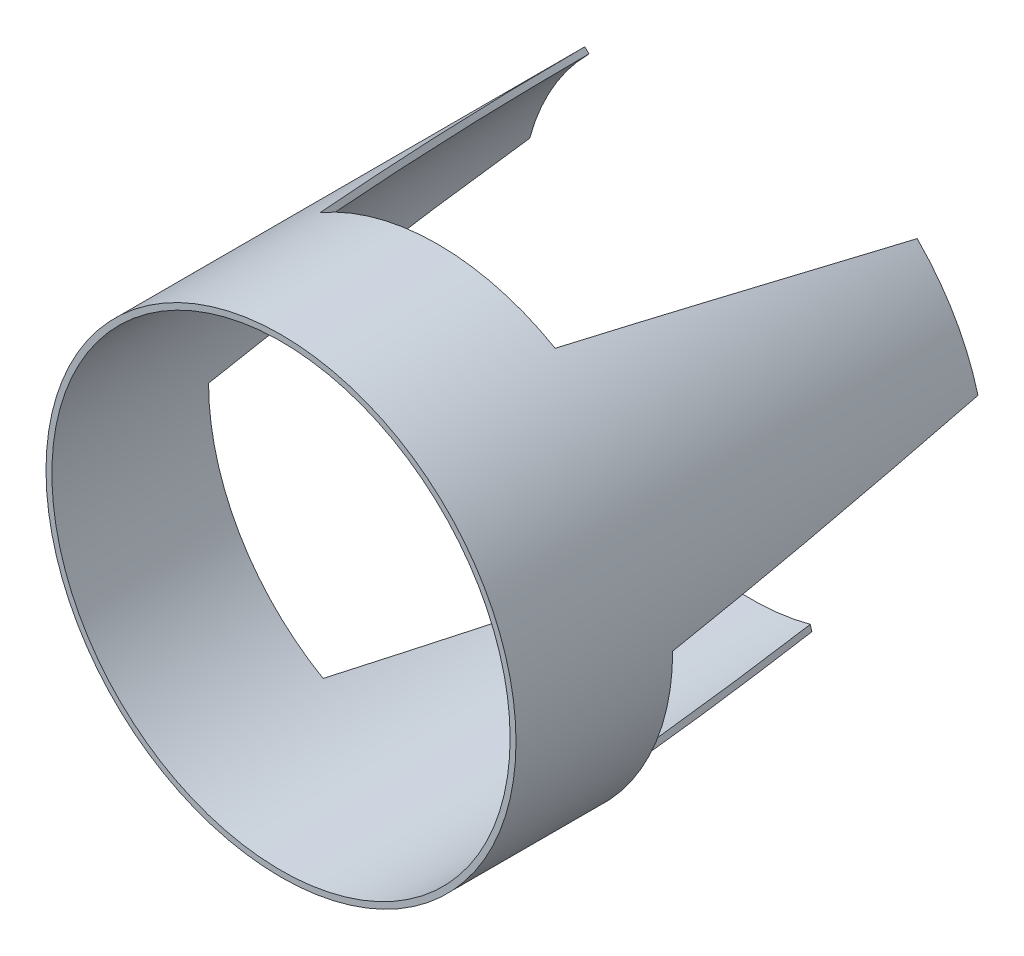
ISO-10303-21;
HEADER;
FILE_DESCRIPTION(('STEP AP214'),'2;1');
FILE_NAME('part.step','',(''),(''),'','','');
FILE_SCHEMA(('AUTOMOTIVE_DESIGN { 1 0 10303 214 1 1 1 1 }'));
ENDSEC;
DATA;
#1=APPLICATION_CONTEXT('core data for automotive mechanical design processes');
#2=APPLICATION_PROTOCOL_DEFINITION('international standard','automotive_design',2000,#1);
#3=PRODUCT_CONTEXT('',#1,'mechanical');
#4=PRODUCT('Part','Part','',(#3));
#5=PRODUCT_RELATED_PRODUCT_CATEGORY('part','',(#4));
#6=PRODUCT_DEFINITION_FORMATION('','',#4);
#7=PRODUCT_DEFINITION_CONTEXT('part definition',#1,'design');
#8=PRODUCT_DEFINITION('design','',#6,#7);
#9=PRODUCT_DEFINITION_SHAPE('','',#8);
#10=(LENGTH_UNIT() NAMED_UNIT(*) SI_UNIT(.MILLI.,.METRE.));
#11=(NAMED_UNIT(*) PLANE_ANGLE_UNIT() SI_UNIT($,.RADIAN.));
#12=(NAMED_UNIT(*) SI_UNIT($,.STERADIAN.) SOLID_ANGLE_UNIT());
#13=UNCERTAINTY_MEASURE_WITH_UNIT(LENGTH_MEASURE(1.E-05),#10,'distance_accuracy_value','');
#14=(GEOMETRIC_REPRESENTATION_CONTEXT(3) GLOBAL_UNCERTAINTY_ASSIGNED_CONTEXT((#13)) GLOBAL_UNIT_ASSIGNED_CONTEXT((#10,
#11,#12)) REPRESENTATION_CONTEXT('',''));
#15=CARTESIAN_POINT('',(0.,0.,0.));
#16=DIRECTION('',(0.,0.,1.));
#17=DIRECTION('',(1.,0.,0.));
#18=AXIS2_PLACEMENT_3D('',#15,#16,#17);
#19=CARTESIAN_POINT('',(0.,0.,0.));
#20=DIRECTION('',(0.,0.,-1.));
#21=DIRECTION('',(-1.,0.,0.));
#22=AXIS2_PLACEMENT_3D('',#19,#20,#21);
#23=PLANE('',#22);
#24=DIRECTION('',(-0.258819045102517,-0.965925826289069,0.));
#25=VECTOR('',#24,1.);
#26=CARTESIAN_POINT('',(-15.1409141384972,-56.5066608379106,0.));
#27=LINE('',#26,#25);
#28=CARTESIAN_POINT('',(-15.1409141384972,-56.5066608379106,0.));
#29=VERTEX_POINT('',#28);
#30=CARTESIAN_POINT('',(-15.5291427060463,-57.9555495773722,0.));
#31=VERTEX_POINT('',#30);
#32=EDGE_CURVE('E115',#29,#31,#27,.T.);
#33=ORIENTED_EDGE('',*,*,#32,.F.);
#34=CARTESIAN_POINT('',(0.,0.,0.));
#35=DIRECTION('',(0.,0.,1.));
#36=DIRECTION('',(1.,0.,0.));
#37=AXIS2_PLACEMENT_3D('',#34,#35,#36);
#38=CIRCLE('',#37,58.5);
#39=CARTESIAN_POINT('',(15.1409141384977,-56.5066608379105,0.));
#40=VERTEX_POINT('',#39);
#41=EDGE_CURVE('E45',#29,#40,#38,.T.);
#42=ORIENTED_EDGE('',*,*,#41,.T.);
#43=DIRECTION('',(-0.258819045102526,0.965925826289067,0.));
#44=VECTOR('',#43,1.);
#45=CARTESIAN_POINT('',(15.5291427061514,-57.955549577344,0.));
#46=LINE('',#45,#44);
#47=CARTESIAN_POINT('',(15.5291427061514,-57.9555495773441,0.));
#48=VERTEX_POINT('',#47);
#49=EDGE_CURVE('E163',#48,#40,#46,.T.);
#50=ORIENTED_EDGE('',*,*,#49,.F.);
#51=CARTESIAN_POINT('',(0.,0.,0.));
#52=DIRECTION('',(0.,0.,-1.));
#53=DIRECTION('',(1.,0.,0.));
#54=AXIS2_PLACEMENT_3D('',#51,#52,#53);
#55=CIRCLE('',#54,60.);
#56=EDGE_CURVE('E124',#48,#31,#55,.T.);
#57=ORIENTED_EDGE('',*,*,#56,.T.);
#58=EDGE_LOOP('',(#33,#42,#50,#57));
#59=FACE_BOUND('',#58,.T.);
#60=ADVANCED_FACE('F15',(#59),#23,.T.);
#61=CARTESIAN_POINT('',(42.4264068711928,42.4264068711929,0.));
#62=VERTEX_POINT('',#61);
#63=CARTESIAN_POINT('',(57.9555495773161,15.5291427062558,0.));
#64=VERTEX_POINT('',#63);
#65=EDGE_CURVE('E140',#62,#64,#55,.T.);
#66=ORIENTED_EDGE('',*,*,#65,.T.);
#67=DIRECTION('',(-0.965925826289069,-0.25881904510252,0.));
#68=VECTOR('',#67,1.);
#69=CARTESIAN_POINT('',(57.9555495773441,15.5291427061512,0.));
#70=LINE('',#69,#68);
#71=CARTESIAN_POINT('',(56.5066608379105,15.1409141384975,0.));
#72=VERTEX_POINT('',#71);
#73=EDGE_CURVE('E254',#64,#72,#70,.T.);
#74=ORIENTED_EDGE('',*,*,#73,.T.);
#75=CARTESIAN_POINT('',(41.365746699413,41.3657466994131,0.));
#76=VERTEX_POINT('',#75);
#77=EDGE_CURVE('E136',#72,#76,#38,.T.);
#78=ORIENTED_EDGE('',*,*,#77,.T.);
#79=DIRECTION('',(0.70710678118655,0.707106781186545,0.));
#80=VECTOR('',#79,1.);
#81=CARTESIAN_POINT('',(41.365746699413,41.3657466994131,0.));
#82=LINE('',#81,#80);
#83=EDGE_CURVE('E187',#76,#62,#82,.T.);
#84=ORIENTED_EDGE('',*,*,#83,.T.);
#85=EDGE_LOOP('',(#66,#74,#78,#84));
#86=FACE_BOUND('',#85,.T.);
#87=ADVANCED_FACE('F236',(#86),#23,.T.);
#88=CARTESIAN_POINT('',(0.,0.,120.));
#89=DIRECTION('',(0.,0.,-1.));
#90=DIRECTION('',(-1.,0.,0.));
#91=AXIS2_PLACEMENT_3D('',#88,#89,#90);
#92=CYLINDRICAL_SURFACE('',#91,60.);
#93=CARTESIAN_POINT('',(-60.,0.,80.));
#94=CARTESIAN_POINT('',(-60.0000297278605,0.642846188178234,76.729155216476));
#95=CARTESIAN_POINT('',(-59.9896682161173,1.28735699019478,73.4586421596736));
#96=CARTESIAN_POINT('',(-59.9480690658316,2.57776599537224,66.918011010002));
#97=CARTESIAN_POINT('',(-59.9168313566957,3.22366420321734,63.6478929185058));
#98=CARTESIAN_POINT('',(-59.810945745323,4.86214663308085,55.3490186665964));
#99=CARTESIAN_POINT('',(-59.7219862163258,5.85434948110681,50.3203639184538));
#100=CARTESIAN_POINT('',(-59.4951734283905,7.8302713126087,40.2624703606781));
#101=CARTESIAN_POINT('',(-59.3573200116705,8.81399026869637,35.2332315492124));
#102=CARTESIAN_POINT('',(-59.1151828549255,10.2781494088528,27.6873579864123));
#103=CARTESIAN_POINT('',(-59.0285584961352,10.7643873821746,25.1712691981862));
#104=CARTESIAN_POINT('',(-58.8438519566513,11.7321646658726,20.1386061251849));
#105=CARTESIAN_POINT('',(-58.7457697747269,12.213703975744,17.6220318403577));
#106=CARTESIAN_POINT('',(-58.5385122695138,13.1712755484237,12.5882931329614));
#107=CARTESIAN_POINT('',(-58.4293369469356,13.6473078115847,10.0711287104301));
#108=CARTESIAN_POINT('',(-58.2003281380882,14.5931104246774,5.036108306337));
#109=CARTESIAN_POINT('',(-58.0804946515377,15.0628807744438,2.51825232475699));
#110=CARTESIAN_POINT('',(-57.9555495773441,15.5291427061512,0.));
#111=B_SPLINE_CURVE_WITH_KNOTS('',3,(#93,#94,#95,#96,#97,#98,#99,#100,#101,#102,#103,#104,#105,
#106,#107,#108,#109,#110),.UNSPECIFIED.,.F.,.F.,(4,2,2,2,2,2,2,2,4),(0.,10.0002292757606,
20.0004923677393,35.379377408289,50.7583120774031,58.4506019146751,66.1428925782588,
73.8351827490979,81.5274731229181),.UNSPECIFIED.);
#112=CARTESIAN_POINT('',(-60.,0.,80.));
#113=VERTEX_POINT('',#112);
#114=CARTESIAN_POINT('',(-57.9555495773441,15.5291427061512,0.));
#115=VERTEX_POINT('',#114);
#116=EDGE_CURVE('E373',#113,#115,#111,.T.);
#117=ORIENTED_EDGE('',*,*,#116,.F.);
#118=CARTESIAN_POINT('',(0.,0.,80.));
#119=DIRECTION('',(0.,0.,-1.));
#120=DIRECTION('',(1.,0.,0.));
#121=AXIS2_PLACEMENT_3D('',#118,#119,#120);
#122=CIRCLE('',#121,60.);
#123=CARTESIAN_POINT('',(-30.,-51.9615242270664,80.));
#124=VERTEX_POINT('',#123);
#125=EDGE_CURVE('E318',#124,#113,#122,.T.);
#126=ORIENTED_EDGE('',*,*,#125,.F.);
#127=CARTESIAN_POINT('',(-30.,-51.9615242270664,80.));
#128=CARTESIAN_POINT('',(-29.449918177119,-52.2791469795733,76.7276617860774));
#129=CARTESIAN_POINT('',(-28.892528796003,-52.5892751058101,73.4558291201873));
#130=CARTESIAN_POINT('',(-27.7646466865433,-53.1933532711415,66.9129174843199));
#131=CARTESIAN_POINT('',(-27.1941539142323,-53.4873032559404,63.6418385169086));
#132=CARTESIAN_POINT('',(-25.7316251948103,-54.2112639331826,55.3409911975984));
#133=CARTESIAN_POINT('',(-24.8316806454118,-54.6294204095292,50.3115765500915));
#134=CARTESIAN_POINT('',(-23.0105820483431,-55.4211038979189,40.2530547764168));
#135=CARTESIAN_POINT('',(-22.0894279328347,-55.7946307671919,35.2239476512841));
#136=CARTESIAN_POINT('',(-20.6966454038644,-56.3195837849319,27.6789421458789));
#137=CARTESIAN_POINT('',(-20.2304568865246,-56.4887061159248,25.1632585762426));
#138=CARTESIAN_POINT('',(-19.2953139352809,-56.814927722282,20.1316235411478));
#139=CARTESIAN_POINT('',(-18.8263595010845,-56.972026996375,17.6156720756611));
#140=CARTESIAN_POINT('',(-17.8865546709448,-57.2740317234357,12.5833921683718));
#141=CARTESIAN_POINT('',(-17.4157042751353,-57.4189371772633,10.0670637265958));
#142=CARTESIAN_POINT('',(-16.4729764842333,-57.6964715063335,5.03392219010989));
#143=CARTESIAN_POINT('',(-16.00109908911,-57.8291003812081,2.5171090953855));
#144=CARTESIAN_POINT('',(-15.5291427061511,-57.9555495773441,0.));
#145=B_SPLINE_CURVE_WITH_KNOTS('',3,(#127,#128,#129,#130,#131,#132,#133,#134,#135,#136,#137,
#138,#139,#140,#141,#142,#143,#144),.UNSPECIFIED.,.F.,.F.,(4,2,2,2,2,2,2,2,4),(0.,
10.0002271930249,20.0004879459086,35.3793803521653,50.7583219541819,58.4505909352589,
66.1428607296868,73.8351299816371,81.5273994641764),.UNSPECIFIED.);
#146=EDGE_CURVE('E120',#124,#31,#145,.T.);
#147=ORIENTED_EDGE('',*,*,#146,.T.);
#148=ORIENTED_EDGE('',*,*,#56,.F.);
#149=CARTESIAN_POINT('',(29.9999999996795,-51.9615242272514,80.));
#150=CARTESIAN_POINT('',(29.4499181767901,-52.2791469797586,76.7276617860788));
#151=CARTESIAN_POINT('',(28.8925287956703,-52.5892751059928,73.4558291201892));
#152=CARTESIAN_POINT('',(27.7646466862109,-53.193353271315,66.9129174843209));
#153=CARTESIAN_POINT('',(27.194153913904,-53.4873032561072,63.6418385169083));
#154=CARTESIAN_POINT('',(25.7316251945021,-54.2112639333286,55.3409911975987));
#155=CARTESIAN_POINT('',(24.8316806451241,-54.6294204096595,50.3115765500929));
#156=CARTESIAN_POINT('',(23.0105820481061,-55.4211038980168,40.2530547764184));
#157=CARTESIAN_POINT('',(22.0894279326279,-55.7946307672732,35.2239476512849));
#158=CARTESIAN_POINT('',(20.696645403705,-56.3195837849903,27.6789421458785));
#159=CARTESIAN_POINT('',(20.2304568863813,-56.488706115976,25.1632585762417));
#160=CARTESIAN_POINT('',(19.2953139351695,-56.8149277223197,20.1316235411462));
#161=CARTESIAN_POINT('',(18.826359500989,-56.9720269964064,17.6156720756592));
#162=CARTESIAN_POINT('',(17.8865546708798,-57.2740317234558,12.5833921683697));
#163=CARTESIAN_POINT('',(17.415704275085,-57.4189371772785,10.0670637265938));
#164=CARTESIAN_POINT('',(16.4729764842101,-57.69647150634,5.03392219010848));
#165=CARTESIAN_POINT('',(16.0010990890994,-57.8291003812109,2.51710909538463));
#166=CARTESIAN_POINT('',(15.5291427061514,-57.9555495773441,0.));
#167=B_SPLINE_CURVE_WITH_KNOTS('',3,(#149,#150,#151,#152,#153,#154,#155,#156,#157,#158,#159,
#160,#161,#162,#163,#164,#165,#166),.UNSPECIFIED.,.F.,.F.,(4,2,2,2,2,2,2,2,4),(0.,
10.0002271930248,20.0004879459085,35.3793803521476,50.7583219541467,58.4505909352146,
66.1428607296335,73.8351299815747,81.5273994641049),.UNSPECIFIED.);
#168=CARTESIAN_POINT('',(29.9999999996795,-51.9615242272514,80.));
#169=VERTEX_POINT('',#168);
#170=EDGE_CURVE('E285',#169,#48,#167,.T.);
#171=ORIENTED_EDGE('',*,*,#170,.F.);
#172=CARTESIAN_POINT('',(0.,0.,80.));
#173=DIRECTION('',(0.,0.,-1.));
#174=DIRECTION('',(1.,0.,0.));
#175=AXIS2_PLACEMENT_3D('',#172,#173,#174);
#176=CIRCLE('',#175,60.);
#177=CARTESIAN_POINT('',(60.,0.,80.));
#178=VERTEX_POINT('',#177);
#179=EDGE_CURVE('E265',#178,#169,#176,.T.);
#180=ORIENTED_EDGE('',*,*,#179,.F.);
#181=CARTESIAN_POINT('',(57.9555495773232,15.5291427062017,0.));
#182=CARTESIAN_POINT('',(58.1199779448731,14.9155976493719,3.27233821391632));
#183=CARTESIAN_POINT('',(58.2752757240985,14.2969337853482,6.54417087980376));
#184=CARTESIAN_POINT('',(58.5668530545349,13.0511363928844,13.0870825156694));
#185=CARTESIAN_POINT('',(58.7031325419207,12.4240028360278,16.3581614830814));
#186=CARTESIAN_POINT('',(59.0238945706893,10.8239337630771,24.6590088023933));
#187=CARTESIAN_POINT('',(59.1948799217028,9.84642722067162,29.6884234499006));
#188=CARTESIAN_POINT('',(59.4882524494548,7.88247828905386,39.7469452235767));
#189=CARTESIAN_POINT('',(59.6106394707302,6.89603587126653,44.7760523487103));
#190=CARTESIAN_POINT('',(59.7572265039701,5.41484341735429,52.3210578541167));
#191=CARTESIAN_POINT('',(59.7999276643829,4.92076780832299,54.8367414237534));
#192=CARTESIAN_POINT('',(59.8730007333817,3.93305671579483,59.868376458849));
#193=CARTESIAN_POINT('',(59.903372640664,3.43942123234452,62.3843279243361));
#194=CARTESIAN_POINT('',(59.9518474174738,2.45347490016677,67.4166078316262));
#195=CARTESIAN_POINT('',(59.9699502878666,1.96116405134592,69.9329362734026));
#196=CARTESIAN_POINT('',(59.9940319573644,0.978727760919796,74.9660778098893));
#197=CARTESIAN_POINT('',(60.0000107561062,0.488602319380037,77.4828909046141));
#198=CARTESIAN_POINT('',(60.,0.,80.));
#199=B_SPLINE_CURVE_WITH_KNOTS('',3,(#181,#182,#183,#184,#185,#186,#187,#188,#189,#190,#191,
#192,#193,#194,#195,#196,#197,#198),.UNSPECIFIED.,.F.,.F.,(4,2,2,2,2,2,2,2,4),(0.,
10.0002271930249,20.0004879459086,35.3793803521678,50.7583219541871,58.4505909352654,
66.1428607296946,73.8351299816461,81.5273994641867),.UNSPECIFIED.);
#200=EDGE_CURVE('E262',#64,#178,#199,.T.);
#201=ORIENTED_EDGE('',*,*,#200,.F.);
#202=ORIENTED_EDGE('',*,*,#65,.F.);
#203=CARTESIAN_POINT('',(42.4264068711927,42.4264068711929,0.));
#204=CARTESIAN_POINT('',(41.9826909647803,42.8701610586443,3.27381653027227));
#205=CARTESIAN_POINT('',(41.5294993020639,43.309390646772,6.54695744763124));
#206=CARTESIAN_POINT('',(40.6051656345155,44.1771615529254,13.0921328694367));
#207=CARTESIAN_POINT('',(40.1340235689249,44.6057028347652,16.3641673701004));
#208=CARTESIAN_POINT('',(38.9168331980027,45.6776292055111,24.6669724341608));
#209=CARTESIAN_POINT('',(38.1592193397265,46.3125989616626,29.6971398407958));
#210=CARTESIAN_POINT('',(36.6084927538434,47.5478784948421,39.7562783736417));
#211=CARTESIAN_POINT('',(35.8153799116776,48.1481881600042,44.7852494959395));
#212=CARTESIAN_POINT('',(34.6029979690574,49.0191864175403,52.3293924812002));
#213=CARTESIAN_POINT('',(34.1950082882908,49.3046577881481,54.8446826228858));
#214=CARTESIAN_POINT('',(33.3722431509834,49.8652294404963,59.8753112172308));
#215=CARTESIAN_POINT('',(32.9574676937264,50.140329721142,62.3906496698954));
#216=CARTESIAN_POINT('',(32.1218938800863,50.6796915910874,67.4214875053711));
#217=CARTESIAN_POINT('',(31.701095524159,50.9439531812073,69.9369868881701));
#218=CARTESIAN_POINT('',(30.8542704173363,51.4612527017276,74.9682597112893));
#219=CARTESIAN_POINT('',(30.4282436662554,51.7142906317298,77.4840331516191));
#220=CARTESIAN_POINT('',(30.,51.9615242270664,80.));
#221=B_SPLINE_CURVE_WITH_KNOTS('',3,(#203,#204,#205,#206,#207,#208,#209,#210,#211,#212,#213,
#214,#215,#216,#217,#218,#219,#220),.UNSPECIFIED.,.F.,.F.,(4,2,2,2,2,2,2,2,4),(0.,
10.0002291012252,20.0004920542418,35.3793772810765,50.7583121406814,58.4506020023325,
66.142892675842,73.8351827671622,81.5274731313452),.UNSPECIFIED.);
#222=CARTESIAN_POINT('',(30.,51.9615242270664,80.));
#223=VERTEX_POINT('',#222);
#224=EDGE_CURVE('E225',#62,#223,#221,.T.);
#225=ORIENTED_EDGE('',*,*,#224,.T.);
#226=CARTESIAN_POINT('',(0.,0.,80.));
#227=DIRECTION('',(0.,0.,1.));
#228=DIRECTION('',(1.,0.,0.));
#229=AXIS2_PLACEMENT_3D('',#226,#227,#228);
#230=CIRCLE('',#229,60.);
#231=CARTESIAN_POINT('',(-30.,51.9615242270663,80.));
#232=VERTEX_POINT('',#231);
#233=EDGE_CURVE('E175',#223,#232,#230,.T.);
#234=ORIENTED_EDGE('',*,*,#233,.T.);
#235=CARTESIAN_POINT('',(-42.4264068712243,42.4264068711476,0.));
#236=CARTESIAN_POINT('',(-41.9826909647928,42.8701610586269,3.27381653026588));
#237=CARTESIAN_POINT('',(-41.5294993020684,43.3093906467663,6.54695744762219));
#238=CARTESIAN_POINT('',(-40.605165634514,44.1771615529284,13.0921328694257));
#239=CARTESIAN_POINT('',(-40.1340235689254,44.6057028347652,16.3641673700901));
#240=CARTESIAN_POINT('',(-38.9168331980056,45.6776292055077,24.6669724341522));
#241=CARTESIAN_POINT('',(-38.1592193397282,46.312598961661,29.6971398407876));
#242=CARTESIAN_POINT('',(-36.6084927538441,47.5478784948418,39.7562783736349));
#243=CARTESIAN_POINT('',(-35.8153799116787,48.1481881600034,44.7852494959337));
#244=CARTESIAN_POINT('',(-34.6029979690583,49.0191864175396,52.3293924811956));
#245=CARTESIAN_POINT('',(-34.1950082882915,49.3046577881476,54.8446826228816));
#246=CARTESIAN_POINT('',(-33.3722431509839,49.8652294404959,59.8753112172275));
#247=CARTESIAN_POINT('',(-32.9574676937269,50.1403297211417,62.3906496698924));
#248=CARTESIAN_POINT('',(-32.1218938800867,50.6796915910872,67.421487505369));
#249=CARTESIAN_POINT('',(-31.7010955241593,50.9439531812071,69.9369868881684));
#250=CARTESIAN_POINT('',(-30.8542704173365,51.4612527017274,74.9682597112884));
#251=CARTESIAN_POINT('',(-30.4282436662555,51.7142906317297,77.4840331516187));
#252=CARTESIAN_POINT('',(-30.,51.9615242270663,80.));
#253=B_SPLINE_CURVE_WITH_KNOTS('',3,(#235,#236,#237,#238,#239,#240,#241,#242,#243,#244,#245,
#246,#247,#248,#249,#250,#251,#252),.UNSPECIFIED.,.F.,.F.,(4,2,2,2,2,2,2,2,4),(0.,
10.0002291012252,20.0004920542418,35.379377281079,50.7583121406865,58.4506020023389,
66.1428926758497,73.8351827671712,81.5274731313554),.UNSPECIFIED.);
#254=CARTESIAN_POINT('',(-42.4264068712695,42.4264068711162,0.));
#255=VERTEX_POINT('',#254);
#256=EDGE_CURVE('E191',#255,#232,#253,.T.);
#257=ORIENTED_EDGE('',*,*,#256,.F.);
#258=EDGE_CURVE('E144',#115,#255,#55,.T.);
#259=ORIENTED_EDGE('',*,*,#258,.F.);
#260=EDGE_LOOP('',(#117,#126,#147,#148,#171,#180,#201,#202,#225,#234,#257,#259));
#261=FACE_BOUND('',#260,.T.);
#262=CARTESIAN_POINT('',(0.,0.,120.));
#263=DIRECTION('',(0.,0.,-1.));
#264=DIRECTION('',(1.,0.,0.));
#265=AXIS2_PLACEMENT_3D('',#262,#263,#264);
#266=CIRCLE('',#265,60.);
#267=CARTESIAN_POINT('',(60.,0.,120.));
#268=VERTEX_POINT('',#267);
#269=EDGE_CURVE('E29',#268,#268,#266,.T.);
#270=ORIENTED_EDGE('',*,*,#269,.T.);
#271=EDGE_LOOP('',(#270));
#272=FACE_BOUND('',#271,.T.);
#273=ADVANCED_FACE('F17',(#261,#272),#92,.T.);
#274=CARTESIAN_POINT('',(0.,0.,120.));
#275=DIRECTION('',(0.,0.,-1.));
#276=DIRECTION('',(-1.,0.,0.));
#277=AXIS2_PLACEMENT_3D('',#274,#275,#276);
#278=CYLINDRICAL_SURFACE('',#277,58.5);
#279=CARTESIAN_POINT('',(-56.5066608379105,15.1409141384975,0.));
#280=CARTESIAN_POINT('',(-56.665133081322,14.5495900718735,3.27671681996334));
#281=CARTESIAN_POINT('',(-56.8151639505784,13.9524337589931,6.55278500622296));
#282=CARTESIAN_POINT('',(-57.0974394424844,12.7481053413693,13.1038574244906));
#283=CARTESIAN_POINT('',(-57.2296840079802,12.1409332044485,16.378861653046));
#284=CARTESIAN_POINT('',(-57.5413558270648,10.5905425082543,24.6831792002893));
#285=CARTESIAN_POINT('',(-57.7080800487891,9.64163992125897,29.7119136706062));
#286=CARTESIAN_POINT('',(-57.995003882037,7.73064746314074,39.7682230053539));
#287=CARTESIAN_POINT('',(-58.1152033509253,6.76855755159752,44.7957978661823));
#288=CARTESIAN_POINT('',(-58.25957129881,5.32053621334813,52.3377976076832));
#289=CARTESIAN_POINT('',(-58.3017096255573,4.83696312981938,54.8523430321078));
#290=CARTESIAN_POINT('',(-58.3739269843225,3.86911645167917,59.8814745793669));
#291=CARTESIAN_POINT('',(-58.4040060151308,3.38484285699745,62.3960607022054));
#292=CARTESIAN_POINT('',(-58.45207981319,2.41646778255507,67.4253809119557));
#293=CARTESIAN_POINT('',(-58.4700745811758,1.93236630278395,69.9401149988585));
#294=CARTESIAN_POINT('',(-58.4940401716998,0.9651947538237,74.9698388721782));
#295=CARTESIAN_POINT('',(-58.5000109938265,0.482124684669869,77.4848286586038));
#296=CARTESIAN_POINT('',(-58.5,0.,80.));
#297=B_SPLINE_CURVE_WITH_KNOTS('',3,(#279,#280,#281,#282,#283,#284,#285,#286,#287,#288,#289,
#290,#291,#292,#293,#294,#295,#296),.UNSPECIFIED.,.F.,.F.,(4,2,2,2,2,2,2,2,4),(0.,
10.0002187847044,20.0004697029164,35.3608147237945,50.7212068359689,58.4040872835754,
66.0869685018003,73.7698492527808,81.4527302666865),.UNSPECIFIED.);
#298=CARTESIAN_POINT('',(-56.5066608379106,15.1409141384972,0.));
#299=VERTEX_POINT('',#298);
#300=CARTESIAN_POINT('',(-58.5,0.,80.));
#301=VERTEX_POINT('',#300);
#302=EDGE_CURVE('E126',#299,#301,#297,.T.);
#303=ORIENTED_EDGE('',*,*,#302,.F.);
#304=CARTESIAN_POINT('',(-41.3657466994131,41.365746699413,0.));
#305=VERTEX_POINT('',#304);
#306=EDGE_CURVE('E135',#305,#299,#38,.T.);
#307=ORIENTED_EDGE('',*,*,#306,.F.);
#308=CARTESIAN_POINT('',(-29.25,50.6624861213897,80.));
#309=CARTESIAN_POINT('',(-29.7934820668227,50.3487403085312,76.7261884463695));
#310=CARTESIAN_POINT('',(-30.3332768047969,50.0253956209949,73.452689103681));
#311=CARTESIAN_POINT('',(-31.4038009237912,49.3603842146667,66.9060582525235));
#312=CARTESIAN_POINT('',(-31.9345302757081,49.0187174370691,63.6329267452688));
#313=CARTESIAN_POINT('',(-33.266814638787,48.1301325612112,55.3324462973502));
#314=CARTESIAN_POINT('',(-34.061056999286,47.57135859691,50.3051872458189));
#315=CARTESIAN_POINT('',(-35.6184564528648,46.4167545083861,40.2500905921451));
#316=CARTESIAN_POINT('',(-36.3816134506451,45.8209242705725,35.2222529882764));
#317=CARTESIAN_POINT('',(-37.4994067490524,44.9029777080878,27.6785616400319));
#318=CARTESIAN_POINT('',(-37.8675761035815,44.5929057097775,25.1632358367911));
#319=CARTESIAN_POINT('',(-38.5943445409898,43.9654066688126,20.1321167632369));
#320=CARTESIAN_POINT('',(-38.9529436228914,43.6479796254065,17.6163234928758));
#321=CARTESIAN_POINT('',(-39.6600684459768,43.006474002426,12.5841700396542));
#322=CARTESIAN_POINT('',(-40.0085941876577,42.6823954231796,10.0678098568218));
#323=CARTESIAN_POINT('',(-40.6951488943581,42.0283232171183,5.03442631436485));
#324=CARTESIAN_POINT('',(-41.0331778591131,41.6983295901543,2.51740295472363));
#325=CARTESIAN_POINT('',(-41.3657466994131,41.365746699413,0.));
#326=B_SPLINE_CURVE_WITH_KNOTS('',3,(#308,#309,#310,#311,#312,#313,#314,#315,#316,#317,#318,
#319,#320,#321,#322,#323,#324,#325),.UNSPECIFIED.,.F.,.F.,(4,2,2,2,2,2,2,2,4),(0.,
10.0002189581913,20.0004700145156,35.3608148506062,50.721206773986,58.4040871974441,
66.0869684058448,73.769849235224,81.452730258287),.UNSPECIFIED.);
#327=CARTESIAN_POINT('',(-29.25,50.6624861213897,80.));
#328=VERTEX_POINT('',#327);
#329=EDGE_CURVE('E189',#328,#305,#326,.T.);
#330=ORIENTED_EDGE('',*,*,#329,.F.);
#331=CARTESIAN_POINT('',(0.,0.,80.));
#332=DIRECTION('',(0.,0.,-1.));
#333=DIRECTION('',(1.,0.,0.));
#334=AXIS2_PLACEMENT_3D('',#331,#332,#333);
#335=CIRCLE('',#334,58.5);
#336=CARTESIAN_POINT('',(29.25,50.6624861213897,80.));
#337=VERTEX_POINT('',#336);
#338=EDGE_CURVE('E172',#328,#337,#335,.T.);
#339=ORIENTED_EDGE('',*,*,#338,.T.);
#340=CARTESIAN_POINT('',(29.25,50.6624861213897,80.));
#341=CARTESIAN_POINT('',(29.7934820668227,50.3487403085312,76.7261884463695));
#342=CARTESIAN_POINT('',(30.3332768047969,50.0253956209949,73.452689103681));
#343=CARTESIAN_POINT('',(31.4038009237911,49.3603842146668,66.9060582525235));
#344=CARTESIAN_POINT('',(31.934530275708,49.0187174370692,63.6329267452688));
#345=CARTESIAN_POINT('',(33.2668146387869,48.1301325612113,55.3324462973502));
#346=CARTESIAN_POINT('',(34.0610569992859,47.5713585969101,50.3051872458189));
#347=CARTESIAN_POINT('',(35.6184564528648,46.4167545083861,40.2500905921451));
#348=CARTESIAN_POINT('',(36.381613450645,45.8209242705727,35.2222529882764));
#349=CARTESIAN_POINT('',(37.4994067490524,44.9029777080879,27.6785616400319));
#350=CARTESIAN_POINT('',(37.8675761035814,44.5929057097776,25.1632358367911));
#351=CARTESIAN_POINT('',(38.5943445409898,43.9654066688126,20.1321167632369));
#352=CARTESIAN_POINT('',(38.9529436228913,43.6479796254066,17.6163234928758));
#353=CARTESIAN_POINT('',(39.6600684459768,43.006474002426,12.5841700396543));
#354=CARTESIAN_POINT('',(40.0085941876576,42.6823954231797,10.0678098568218));
#355=CARTESIAN_POINT('',(40.695148894358,42.0283232171184,5.03442631436486));
#356=CARTESIAN_POINT('',(41.033177859113,41.6983295901544,2.51740295472363));
#357=CARTESIAN_POINT('',(41.365746699413,41.3657466994131,0.));
#358=B_SPLINE_CURVE_WITH_KNOTS('',3,(#340,#341,#342,#343,#344,#345,#346,#347,#348,#349,#350,
#351,#352,#353,#354,#355,#356,#357),.UNSPECIFIED.,.F.,.F.,(4,2,2,2,2,2,2,2,4),(0.,
10.0002189581913,20.0004700145155,35.3608148506062,50.721206773986,58.4040871974441,
66.0869684058447,73.769849235224,81.4527302582869),.UNSPECIFIED.);
#359=EDGE_CURVE('E344',#337,#76,#358,.T.);
#360=ORIENTED_EDGE('',*,*,#359,.T.);
#361=ORIENTED_EDGE('',*,*,#77,.F.);
#362=CARTESIAN_POINT('',(58.5,0.,80.));
#363=CARTESIAN_POINT('',(58.5000279112713,0.619871450668814,76.7247281897064));
#364=CARTESIAN_POINT('',(58.4901471572572,1.24226877193695,73.4499387018946));
#365=CARTESIAN_POINT('',(58.4503004695873,2.49025166738789,66.9010786617265));
#366=CARTESIAN_POINT('',(58.4203344719799,3.11583725171588,63.6270081116925));
#367=CARTESIAN_POINT('',(58.3185331767573,4.70399519284914,55.3246014497831));
#368=CARTESIAN_POINT('',(58.2328650746395,5.66746521826618,50.2966011361638));
#369=CARTESIAN_POINT('',(58.0135321941969,7.5905558263048,40.2408924578767));
#370=CARTESIAN_POINT('',(57.8798672700895,8.55017639722534,35.213184094142));
#371=CARTESIAN_POINT('',(57.6441669017083,9.98170086670775,27.6703413611001));
#372=CARTESIAN_POINT('',(57.5597152821869,10.4576396536464,25.1554116685776));
#373=CARTESIAN_POINT('',(57.379319343211,11.405990405928,20.1252971985197));
#374=CARTESIAN_POINT('',(57.2833750226018,11.8784023709165,17.6101124209586));
#375=CARTESIAN_POINT('',(57.0802737819929,12.8188815305952,12.5793839712325));
#376=CARTESIAN_POINT('',(56.9731168626187,13.2869487255278,10.0638402990875));
#377=CARTESIAN_POINT('',(56.7479443610122,14.217964184224,5.03229165471678));
#378=CARTESIAN_POINT('',(56.6299287784674,14.6809124478403,2.51628668247776));
#379=CARTESIAN_POINT('',(56.5066608379105,15.1409141384975,0.));
#380=B_SPLINE_CURVE_WITH_KNOTS('',3,(#362,#363,#364,#365,#366,#367,#368,#369,#370,#371,#372,
#373,#374,#375,#376,#377,#378,#379),.UNSPECIFIED.,.F.,.F.,(4,2,2,2,2,2,2,2,4),(0.,
10.0002168652238,20.0004655713968,35.3608177727124,50.7212166290331,58.4040761512222,
66.0869364453943,73.7697963110571,81.4526563979145),.UNSPECIFIED.);
#381=CARTESIAN_POINT('',(58.5,0.,80.));
#382=VERTEX_POINT('',#381);
#383=EDGE_CURVE('E269',#382,#72,#380,.T.);
#384=ORIENTED_EDGE('',*,*,#383,.F.);
#385=CARTESIAN_POINT('',(0.,0.,80.));
#386=DIRECTION('',(0.,0.,1.));
#387=DIRECTION('',(1.,0.,0.));
#388=AXIS2_PLACEMENT_3D('',#385,#386,#387);
#389=CIRCLE('',#388,58.5);
#390=CARTESIAN_POINT('',(29.250000000045,-50.6624861213637,80.));
#391=VERTEX_POINT('',#390);
#392=EDGE_CURVE('E337',#391,#382,#389,.T.);
#393=ORIENTED_EDGE('',*,*,#392,.F.);
#394=CARTESIAN_POINT('',(15.1409141384977,-56.5066608379105,0.));
#395=CARTESIAN_POINT('',(15.7396712056484,-56.3462532611793,3.27527181029324));
#396=CARTESIAN_POINT('',(16.338303525155,-56.175620905329,6.55006129810509));
#397=CARTESIAN_POINT('',(17.5334493529803,-55.8141302193131,13.098921338274));
#398=CARTESIAN_POINT('',(18.1299628545467,-55.6232718247492,16.3729918883088));
#399=CARTESIAN_POINT('',(19.6376575120823,-55.1138938027521,24.6753985502213));
#400=CARTESIAN_POINT('',(20.5461255560936,-54.7817803784675,29.7033988638432));
#401=CARTESIAN_POINT('',(22.3469209140035,-54.0721886098818,39.7591075421347));
#402=CARTESIAN_POINT('',(23.2392481788682,-53.694710127794,44.7868159058713));
#403=CARTESIAN_POINT('',(24.5609908906324,-53.0965352584772,52.3296586389142));
#404=CARTESIAN_POINT('',(24.9988547691489,-52.8917792357465,54.8445883314368));
#405=CARTESIAN_POINT('',(25.8682013484989,-52.4720789032018,59.8747028014943));
#406=CARTESIAN_POINT('',(26.2996840486911,-52.2571345923641,62.3898875790547));
#407=CARTESIAN_POINT('',(27.1555506889719,-51.8175399406551,67.4206160287787));
#408=CARTESIAN_POINT('',(27.5799346294564,-51.5928896003251,69.9361597009222));
#409=CARTESIAN_POINT('',(28.4209475738587,-51.1344251336456,74.9677083452889));
#410=CARTESIAN_POINT('',(28.8375765775533,-50.9006110070322,77.4837133175254));
#411=CARTESIAN_POINT('',(29.250000000045,-50.6624861213637,80.));
#412=B_SPLINE_CURVE_WITH_KNOTS('',3,(#394,#395,#396,#397,#398,#399,#400,#401,#402,#403,#404,
#405,#406,#407,#408,#409,#410,#411),.UNSPECIFIED.,.F.,.F.,(4,2,2,2,2,2,2,2,4),(0.,
10.0002168652237,20.0004655713967,35.3608177727147,50.7212166290379,58.4040761512281,
66.0869364454015,73.7697963110655,81.4526563979241),.UNSPECIFIED.);
#413=EDGE_CURVE('E134',#40,#391,#412,.T.);
#414=ORIENTED_EDGE('',*,*,#413,.F.);
#415=ORIENTED_EDGE('',*,*,#41,.F.);
#416=CARTESIAN_POINT('',(-15.1409141384813,-56.506660837913,0.));
#417=CARTESIAN_POINT('',(-15.7396712056404,-56.3462532611808,3.27527181029169));
#418=CARTESIAN_POINT('',(-16.338303525152,-56.1756209053297,6.5500612981026));
#419=CARTESIAN_POINT('',(-17.5334493529854,-55.8141302193117,13.09892133827));
#420=CARTESIAN_POINT('',(-18.1299628545548,-55.6232718247467,16.3729918883042));
#421=CARTESIAN_POINT('',(-19.6376575121012,-55.1138938027453,24.6753985502141));
#422=CARTESIAN_POINT('',(-20.5461255561219,-54.781780378457,29.7033988638336));
#423=CARTESIAN_POINT('',(-22.3469209140459,-54.0721886098645,39.7591075421213));
#424=CARTESIAN_POINT('',(-23.2392481789154,-53.6947101277737,44.7868159058564));
#425=CARTESIAN_POINT('',(-24.5609908906792,-53.0965352584556,52.3296586388987));
#426=CARTESIAN_POINT('',(-24.9988547691944,-52.8917792357249,54.8445883314213));
#427=CARTESIAN_POINT('',(-25.8682013485384,-52.4720789031823,59.8747028014796));
#428=CARTESIAN_POINT('',(-26.299684048726,-52.2571345923465,62.3898875790408));
#429=CARTESIAN_POINT('',(-27.1555506889937,-51.8175399406436,67.4206160287671));
#430=CARTESIAN_POINT('',(-27.5799346294697,-51.5928896003179,69.9361597009122));
#431=CARTESIAN_POINT('',(-28.4209475738506,-51.13442513365,74.9677083452831));
#432=CARTESIAN_POINT('',(-28.8375765775323,-50.900611007044,77.4837133175222));
#433=CARTESIAN_POINT('',(-29.2500000000087,-50.6624861213847,80.));
#434=B_SPLINE_CURVE_WITH_KNOTS('',3,(#416,#417,#418,#419,#420,#421,#422,#423,#424,#425,#426,
#427,#428,#429,#430,#431,#432,#433),.UNSPECIFIED.,.F.,.F.,(4,2,2,2,2,2,2,2,4),(0.,
10.0002168652238,20.0004655713968,35.3608177727136,50.7212166290356,58.4040761512252,
66.086936445398,73.7697963110614,81.4526563979194),.UNSPECIFIED.);
#435=CARTESIAN_POINT('',(-29.2500000000087,-50.6624861213847,80.));
#436=VERTEX_POINT('',#435);
#437=EDGE_CURVE('E112',#29,#436,#434,.T.);
#438=ORIENTED_EDGE('',*,*,#437,.T.);
#439=CARTESIAN_POINT('',(0.,0.,80.));
#440=DIRECTION('',(0.,0.,1.));
#441=DIRECTION('',(1.,0.,0.));
#442=AXIS2_PLACEMENT_3D('',#439,#440,#441);
#443=CIRCLE('',#442,58.5);
#444=EDGE_CURVE('E37',#301,#436,#443,.T.);
#445=ORIENTED_EDGE('',*,*,#444,.F.);
#446=EDGE_LOOP('',(#303,#307,#330,#339,#360,#361,#384,#393,#414,#415,#438,#445));
#447=FACE_BOUND('',#446,.T.);
#448=CARTESIAN_POINT('',(0.,0.,120.));
#449=DIRECTION('',(0.,0.,1.));
#450=DIRECTION('',(1.,0.,0.));
#451=AXIS2_PLACEMENT_3D('',#448,#449,#450);
#452=CIRCLE('',#451,58.5);
#453=CARTESIAN_POINT('',(58.5,0.,120.));
#454=VERTEX_POINT('',#453);
#455=EDGE_CURVE('E9',#454,#454,#452,.T.);
#456=ORIENTED_EDGE('',*,*,#455,.T.);
#457=EDGE_LOOP('',(#456));
#458=FACE_BOUND('',#457,.T.);
#459=ADVANCED_FACE('F130',(#447,#458),#278,.F.);
#460=DIRECTION('',(0.965925826289069,-0.25881904510252,0.));
#461=VECTOR('',#460,1.);
#462=CARTESIAN_POINT('',(-57.9555495773441,15.5291427061512,0.));
#463=LINE('',#462,#461);
#464=EDGE_CURVE('E125',#115,#299,#463,.T.);
#465=ORIENTED_EDGE('',*,*,#464,.F.);
#466=ORIENTED_EDGE('',*,*,#258,.T.);
#467=DIRECTION('',(0.707106781186548,-0.707106781186548,0.));
#468=VECTOR('',#467,1.);
#469=CARTESIAN_POINT('',(-42.4264068711929,42.4264068711928,0.));
#470=LINE('',#469,#468);
#471=EDGE_CURVE('E178',#255,#305,#470,.T.);
#472=ORIENTED_EDGE('',*,*,#471,.T.);
#473=ORIENTED_EDGE('',*,*,#306,.T.);
#474=EDGE_LOOP('',(#465,#466,#472,#473));
#475=FACE_BOUND('',#474,.T.);
#476=ADVANCED_FACE('F232',(#475),#23,.T.);
#477=CARTESIAN_POINT('',(0.,0.,120.));
#478=DIRECTION('',(0.,0.,-1.));
#479=DIRECTION('',(-1.,0.,0.));
#480=AXIS2_PLACEMENT_3D('',#477,#478,#479);
#481=PLANE('',#480);
#482=ORIENTED_EDGE('',*,*,#269,.F.);
#483=EDGE_LOOP('',(#482));
#484=FACE_BOUND('',#483,.T.);
#485=ORIENTED_EDGE('',*,*,#455,.F.);
#486=EDGE_LOOP('',(#485));
#487=FACE_BOUND('',#486,.T.);
#488=ADVANCED_FACE('F228',(#484,#487),#481,.F.);
#489=CARTESIAN_POINT('',(0.,0.,80.));
#490=DIRECTION('',(0.,0.,1.));
#491=DIRECTION('',(1.,0.,0.));
#492=AXIS2_PLACEMENT_3D('',#489,#490,#491);
#493=PLANE('',#492);
#494=ORIENTED_EDGE('',*,*,#338,.F.);
#495=CARTESIAN_POINT('',(-32.125,55.6421321931502,80.));
#496=CARTESIAN_POINT('',(-27.125,46.9818781553058,80.));
#497=B_SPLINE_CURVE_WITH_KNOTS('',1,(#495,#496),.UNSPECIFIED.,.F.,.F.,(2,2),(0.,1.),.UNSPECIFIED.);
#498=EDGE_CURVE('E192',#232,#328,#497,.T.);
#499=ORIENTED_EDGE('',*,*,#498,.F.);
#500=ORIENTED_EDGE('',*,*,#233,.F.);
#501=CARTESIAN_POINT('',(32.125,55.6421321931502,80.));
#502=CARTESIAN_POINT('',(27.125,46.9818781553059,80.));
#503=B_SPLINE_CURVE_WITH_KNOTS('',1,(#501,#502),.UNSPECIFIED.,.F.,.F.,(2,2),(0.,1.),.UNSPECIFIED.);
#504=EDGE_CURVE('E340',#223,#337,#503,.T.);
#505=ORIENTED_EDGE('',*,*,#504,.T.);
#506=EDGE_LOOP('',(#494,#499,#500,#505));
#507=FACE_BOUND('',#506,.T.);
#508=ADVANCED_FACE('F209',(#507),#493,.F.);
#509=CARTESIAN_POINT('',(-32.125,55.6421321931502,80.));
#510=CARTESIAN_POINT('',(-45.9619407771256,45.9619407771256,0.));
#511=CARTESIAN_POINT('',(-27.125,46.9818781553058,80.));
#512=CARTESIAN_POINT('',(-38.8908729652601,38.8908729652601,0.));
#513=B_SPLINE_SURFACE_WITH_KNOTS('',1,1,((#509,#510),(#511,#512)),.UNSPECIFIED.,.F.,.F.,.F.,(2,
2),(2,2),(0.,1.),(0.,1.),.UNSPECIFIED.);
#514=ORIENTED_EDGE('',*,*,#471,.F.);
#515=ORIENTED_EDGE('',*,*,#256,.T.);
#516=ORIENTED_EDGE('',*,*,#498,.T.);
#517=ORIENTED_EDGE('',*,*,#329,.T.);
#518=EDGE_LOOP('',(#514,#515,#516,#517));
#519=FACE_BOUND('',#518,.T.);
#520=ADVANCED_FACE('F203',(#519),#513,.T.);
#521=CARTESIAN_POINT('',(32.125,55.6421321931502,80.));
#522=CARTESIAN_POINT('',(45.9619407771255,45.9619407771257,0.));
#523=CARTESIAN_POINT('',(27.125,46.9818781553059,80.));
#524=CARTESIAN_POINT('',(38.89087296526,38.8908729652602,0.));
#525=B_SPLINE_SURFACE_WITH_KNOTS('',1,1,((#521,#522),(#523,#524)),.UNSPECIFIED.,.F.,.F.,.F.,(2,
2),(2,2),(0.,1.),(0.,1.),.UNSPECIFIED.);
#526=ORIENTED_EDGE('',*,*,#83,.F.);
#527=ORIENTED_EDGE('',*,*,#359,.F.);
#528=ORIENTED_EDGE('',*,*,#504,.F.);
#529=ORIENTED_EDGE('',*,*,#224,.F.);
#530=EDGE_LOOP('',(#526,#527,#528,#529));
#531=FACE_BOUND('',#530,.T.);
#532=ADVANCED_FACE('F208',(#531),#525,.F.);
#533=CARTESIAN_POINT('',(0.,0.,80.));
#534=DIRECTION('',(0.,0.,1.));
#535=DIRECTION('',(1.,0.,0.));
#536=AXIS2_PLACEMENT_3D('',#533,#534,#535);
#537=PLANE('',#536);
#538=ORIENTED_EDGE('',*,*,#392,.T.);
#539=CARTESIAN_POINT('',(53.5,0.,80.));
#540=CARTESIAN_POINT('',(63.5,0.,80.));
#541=B_SPLINE_CURVE_WITH_KNOTS('',1,(#539,#540),.UNSPECIFIED.,.F.,.F.,(2,2),(0.,1.),.UNSPECIFIED.);
#542=EDGE_CURVE('E270',#382,#178,#541,.T.);
#543=ORIENTED_EDGE('',*,*,#542,.T.);
#544=ORIENTED_EDGE('',*,*,#179,.T.);
#545=CARTESIAN_POINT('',(26.7500000012632,-46.3323591017382,80.));
#546=CARTESIAN_POINT('',(31.7499999988268,-54.9926131409892,80.));
#547=B_SPLINE_CURVE_WITH_KNOTS('',1,(#545,#546),.UNSPECIFIED.,.F.,.F.,(2,2),(0.,1.),.UNSPECIFIED.);
#548=EDGE_CURVE('E317',#169,#391,#547,.F.);
#549=ORIENTED_EDGE('',*,*,#548,.T.);
#550=EDGE_LOOP('',(#538,#543,#544,#549));
#551=FACE_BOUND('',#550,.T.);
#552=ADVANCED_FACE('F295',(#551),#537,.F.);
#553=CARTESIAN_POINT('',(53.5,0.,80.));
#554=CARTESIAN_POINT('',(51.6770317064652,13.8468189129849,0.));
#555=CARTESIAN_POINT('',(63.5,0.,80.));
#556=CARTESIAN_POINT('',(61.3362899693559,16.43500936401,0.));
#557=B_SPLINE_SURFACE_WITH_KNOTS('',1,1,((#553,#554),(#555,#556)),.UNSPECIFIED.,.F.,.F.,.F.,(2,
2),(2,2),(0.,1.),(0.,1.),.UNSPECIFIED.);
#558=ORIENTED_EDGE('',*,*,#383,.T.);
#559=ORIENTED_EDGE('',*,*,#73,.F.);
#560=ORIENTED_EDGE('',*,*,#200,.T.);
#561=ORIENTED_EDGE('',*,*,#542,.F.);
#562=EDGE_LOOP('',(#558,#559,#560,#561));
#563=FACE_BOUND('',#562,.T.);
#564=ADVANCED_FACE('F288',(#563),#557,.F.);
#565=CARTESIAN_POINT('',(13.846818912985,-51.6770317064651,0.));
#566=CARTESIAN_POINT('',(26.7500000012632,-46.3323591017382,80.));
#567=CARTESIAN_POINT('',(16.4350093640102,-61.3362899693558,0.));
#568=CARTESIAN_POINT('',(31.7499999988268,-54.9926131409892,80.));
#569=B_SPLINE_SURFACE_WITH_KNOTS('',1,1,((#565,#566),(#567,#568)),.UNSPECIFIED.,.F.,.F.,.F.,(2,
2),(2,2),(0.,1.),(0.,1.),.UNSPECIFIED.);
#570=ORIENTED_EDGE('',*,*,#413,.T.);
#571=ORIENTED_EDGE('',*,*,#548,.F.);
#572=ORIENTED_EDGE('',*,*,#170,.T.);
#573=ORIENTED_EDGE('',*,*,#49,.T.);
#574=EDGE_LOOP('',(#570,#571,#572,#573));
#575=FACE_BOUND('',#574,.T.);
#576=ADVANCED_FACE('F294',(#575),#569,.F.);
#577=CARTESIAN_POINT('',(0.,0.,80.));
#578=DIRECTION('',(0.,0.,1.));
#579=DIRECTION('',(1.,0.,0.));
#580=AXIS2_PLACEMENT_3D('',#577,#578,#579);
#581=PLANE('',#580);
#582=CARTESIAN_POINT('',(-27.5000000000292,-47.6313972081273,80.));
#583=CARTESIAN_POINT('',(-32.4999999999704,-56.2916512460056,80.));
#584=B_SPLINE_CURVE_WITH_KNOTS('',1,(#582,#583),.UNSPECIFIED.,.F.,.F.,(2,2),(0.,1.),.UNSPECIFIED.);
#585=EDGE_CURVE('E117',#124,#436,#584,.F.);
#586=ORIENTED_EDGE('',*,*,#585,.F.);
#587=ORIENTED_EDGE('',*,*,#125,.T.);
#588=CARTESIAN_POINT('',(-64.25,0.,80.));
#589=CARTESIAN_POINT('',(-54.25,0.,80.));
#590=B_SPLINE_CURVE_WITH_KNOTS('',1,(#588,#589),.UNSPECIFIED.,.F.,.F.,(2,2),(0.,1.),.UNSPECIFIED.);
#591=EDGE_CURVE('E119',#113,#301,#590,.T.);
#592=ORIENTED_EDGE('',*,*,#591,.T.);
#593=ORIENTED_EDGE('',*,*,#444,.T.);
#594=EDGE_LOOP('',(#586,#587,#592,#593));
#595=FACE_BOUND('',#594,.T.);
#596=ADVANCED_FACE('F390',(#595),#581,.F.);
#597=CARTESIAN_POINT('',(-64.25,0.,80.));
#598=CARTESIAN_POINT('',(-62.7851787087894,16.8232379316638,0.));
#599=CARTESIAN_POINT('',(-54.25,0.,80.));
#600=CARTESIAN_POINT('',(-53.1259204458988,14.2350474806386,0.));
#601=B_SPLINE_SURFACE_WITH_KNOTS('',1,1,((#597,#598),(#599,#600)),.UNSPECIFIED.,.F.,.F.,.F.,(2,
2),(2,2),(0.,1.),(0.,1.),.UNSPECIFIED.);
#602=ORIENTED_EDGE('',*,*,#302,.T.);
#603=ORIENTED_EDGE('',*,*,#591,.F.);
#604=ORIENTED_EDGE('',*,*,#116,.T.);
#605=ORIENTED_EDGE('',*,*,#464,.T.);
#606=EDGE_LOOP('',(#602,#603,#604,#605));
#607=FACE_BOUND('',#606,.T.);
#608=ADVANCED_FACE('F384',(#607),#601,.F.);
#609=CARTESIAN_POINT('',(-14.2350474806384,-53.1259204458988,0.));
#610=CARTESIAN_POINT('',(-27.5000000000292,-47.6313972081273,80.));
#611=CARTESIAN_POINT('',(-16.8232379316636,-62.7851787087895,0.));
#612=CARTESIAN_POINT('',(-32.4999999999704,-56.2916512460056,80.));
#613=B_SPLINE_SURFACE_WITH_KNOTS('',1,1,((#609,#610),(#611,#612)),.UNSPECIFIED.,.F.,.F.,.F.,(2,
2),(2,2),(0.,1.),(0.,1.),.UNSPECIFIED.);
#614=ORIENTED_EDGE('',*,*,#437,.F.);
#615=ORIENTED_EDGE('',*,*,#32,.T.);
#616=ORIENTED_EDGE('',*,*,#146,.F.);
#617=ORIENTED_EDGE('',*,*,#585,.T.);
#618=EDGE_LOOP('',(#614,#615,#616,#617));
#619=FACE_BOUND('',#618,.T.);
#620=ADVANCED_FACE('F113',(#619),#613,.T.);
#621=CLOSED_SHELL('',(#60,#87,#273,#459,#476,#488,#508,#520,#532,#552,#564,#576,#596,#608,#620));
#622=MANIFOLD_SOLID_BREP('B1',#621);
#623=ADVANCED_BREP_SHAPE_REPRESENTATION('',(#18,#622),#14);
#624=SHAPE_DEFINITION_REPRESENTATION(#9,#623);
ENDSEC;
END-ISO-10303-21;
